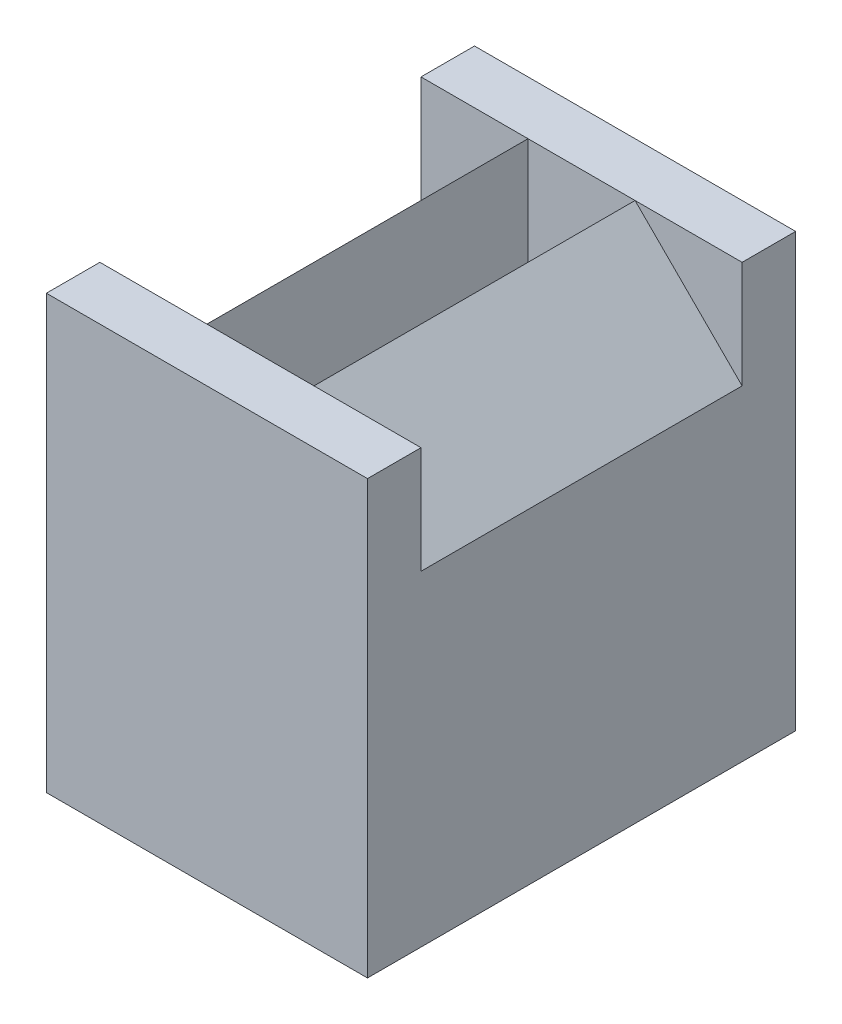
ISO-10303-21;
HEADER;
FILE_DESCRIPTION(('STEP AP214'),'2;1');
FILE_NAME('part.step','',(''),(''),'','','');
FILE_SCHEMA(('AUTOMOTIVE_DESIGN { 1 0 10303 214 1 1 1 1 }'));
ENDSEC;
DATA;
#1=APPLICATION_CONTEXT('core data for automotive mechanical design processes');
#2=APPLICATION_PROTOCOL_DEFINITION('international standard','automotive_design',2000,#1);
#3=PRODUCT_CONTEXT('',#1,'mechanical');
#4=PRODUCT('Part','Part','',(#3));
#5=PRODUCT_RELATED_PRODUCT_CATEGORY('part','',(#4));
#6=PRODUCT_DEFINITION_FORMATION('','',#4);
#7=PRODUCT_DEFINITION_CONTEXT('part definition',#1,'design');
#8=PRODUCT_DEFINITION('design','',#6,#7);
#9=PRODUCT_DEFINITION_SHAPE('','',#8);
#10=(LENGTH_UNIT() NAMED_UNIT(*) SI_UNIT(.MILLI.,.METRE.));
#11=(NAMED_UNIT(*) PLANE_ANGLE_UNIT() SI_UNIT($,.RADIAN.));
#12=(NAMED_UNIT(*) SI_UNIT($,.STERADIAN.) SOLID_ANGLE_UNIT());
#13=UNCERTAINTY_MEASURE_WITH_UNIT(LENGTH_MEASURE(1.E-05),#10,'distance_accuracy_value','');
#14=(GEOMETRIC_REPRESENTATION_CONTEXT(3) GLOBAL_UNCERTAINTY_ASSIGNED_CONTEXT((#13)) GLOBAL_UNIT_ASSIGNED_CONTEXT((#10,
#11,#12)) REPRESENTATION_CONTEXT('',''));
#15=CARTESIAN_POINT('',(0.,0.,0.));
#16=DIRECTION('',(0.,0.,1.));
#17=DIRECTION('',(1.,0.,0.));
#18=AXIS2_PLACEMENT_3D('',#15,#16,#17);
#19=CARTESIAN_POINT('',(10.,0.,40.));
#20=DIRECTION('',(-1.,0.,0.));
#21=DIRECTION('',(0.,0.,1.));
#22=AXIS2_PLACEMENT_3D('',#19,#20,#21);
#23=PLANE('',#22);
#24=DIRECTION('',(0.,1.,0.));
#25=VECTOR('',#24,1.);
#26=CARTESIAN_POINT('',(10.,0.,10.));
#27=LINE('',#26,#25);
#28=CARTESIAN_POINT('',(10.,20.4066823937675,10.));
#29=VERTEX_POINT('',#28);
#30=CARTESIAN_POINT('',(10.,40.4066823937675,10.));
#31=VERTEX_POINT('',#30);
#32=EDGE_CURVE('E268',#29,#31,#27,.T.);
#33=ORIENTED_EDGE('',*,*,#32,.F.);
#34=DIRECTION('',(0.,0.,-1.));
#35=VECTOR('',#34,1.);
#36=CARTESIAN_POINT('',(10.,20.4066823937675,40.));
#37=LINE('',#36,#35);
#38=CARTESIAN_POINT('',(10.,20.4066823937675,70.));
#39=VERTEX_POINT('',#38);
#40=EDGE_CURVE('E12',#39,#29,#37,.T.);
#41=ORIENTED_EDGE('',*,*,#40,.F.);
#42=DIRECTION('',(0.,1.,0.));
#43=VECTOR('',#42,1.);
#44=CARTESIAN_POINT('',(10.,0.,70.));
#45=LINE('',#44,#43);
#46=CARTESIAN_POINT('',(10.,40.4066823937675,70.));
#47=VERTEX_POINT('',#46);
#48=EDGE_CURVE('E182',#39,#47,#45,.T.);
#49=ORIENTED_EDGE('',*,*,#48,.T.);
#50=DIRECTION('',(0.,0.,-1.));
#51=VECTOR('',#50,1.);
#52=CARTESIAN_POINT('',(10.,40.4066823937675,40.));
#53=LINE('',#52,#51);
#54=EDGE_CURVE('E236',#47,#31,#53,.T.);
#55=ORIENTED_EDGE('',*,*,#54,.T.);
#56=EDGE_LOOP('',(#33,#41,#49,#55));
#57=FACE_BOUND('',#56,.T.);
#58=ADVANCED_FACE('F77',(#57),#23,.T.);
#59=CARTESIAN_POINT('',(0.,20.4066823937675,40.));
#60=DIRECTION('',(0.,1.,0.));
#61=DIRECTION('',(-1.,0.,0.));
#62=AXIS2_PLACEMENT_3D('',#59,#60,#61);
#63=PLANE('',#62);
#64=DIRECTION('',(1.,0.,0.));
#65=VECTOR('',#64,1.);
#66=CARTESIAN_POINT('',(0.,20.4066823937675,10.));
#67=LINE('',#66,#65);
#68=CARTESIAN_POINT('',(-9.99999999999999,20.4066823937675,10.));
#69=VERTEX_POINT('',#68);
#70=EDGE_CURVE('E265',#69,#29,#67,.T.);
#71=ORIENTED_EDGE('',*,*,#70,.F.);
#72=DIRECTION('',(0.,0.,-1.));
#73=VECTOR('',#72,1.);
#74=CARTESIAN_POINT('',(-9.99999999999999,20.4066823937675,40.));
#75=LINE('',#74,#73);
#76=CARTESIAN_POINT('',(-9.99999999999999,20.4066823937675,70.));
#77=VERTEX_POINT('',#76);
#78=EDGE_CURVE('E85',#77,#69,#75,.T.);
#79=ORIENTED_EDGE('',*,*,#78,.F.);
#80=DIRECTION('',(1.,0.,0.));
#81=VECTOR('',#80,1.);
#82=CARTESIAN_POINT('',(0.,20.4066823937675,70.));
#83=LINE('',#82,#81);
#84=EDGE_CURVE('E219',#77,#39,#83,.T.);
#85=ORIENTED_EDGE('',*,*,#84,.T.);
#86=ORIENTED_EDGE('',*,*,#40,.T.);
#87=EDGE_LOOP('',(#71,#79,#85,#86));
#88=FACE_BOUND('',#87,.T.);
#89=ADVANCED_FACE('F316',(#88),#63,.T.);
#90=CARTESIAN_POINT('',(-9.99999999999999,0.,40.));
#91=DIRECTION('',(-1.,0.,0.));
#92=DIRECTION('',(0.,0.,1.));
#93=AXIS2_PLACEMENT_3D('',#90,#91,#92);
#94=PLANE('',#93);
#95=ORIENTED_EDGE('',*,*,#78,.T.);
#96=DIRECTION('',(0.,1.,0.));
#97=VECTOR('',#96,1.);
#98=CARTESIAN_POINT('',(-9.99999999999999,0.,10.));
#99=LINE('',#98,#97);
#100=CARTESIAN_POINT('',(-9.99999999999999,40.4066823937675,10.));
#101=VERTEX_POINT('',#100);
#102=EDGE_CURVE('E299',#69,#101,#99,.T.);
#103=ORIENTED_EDGE('',*,*,#102,.T.);
#104=DIRECTION('',(0.,0.,-1.));
#105=VECTOR('',#104,1.);
#106=CARTESIAN_POINT('',(-9.99999999999999,40.4066823937675,40.));
#107=LINE('',#106,#105);
#108=CARTESIAN_POINT('',(-9.99999999999999,40.4066823937675,70.));
#109=VERTEX_POINT('',#108);
#110=EDGE_CURVE('E249',#109,#101,#107,.T.);
#111=ORIENTED_EDGE('',*,*,#110,.F.);
#112=DIRECTION('',(0.,1.,0.));
#113=VECTOR('',#112,1.);
#114=CARTESIAN_POINT('',(-9.99999999999999,0.,70.));
#115=LINE('',#114,#113);
#116=EDGE_CURVE('E322',#77,#109,#115,.T.);
#117=ORIENTED_EDGE('',*,*,#116,.F.);
#118=EDGE_LOOP('',(#95,#103,#111,#117));
#119=FACE_BOUND('',#118,.T.);
#120=ADVANCED_FACE('F320',(#119),#94,.F.);
#121=CARTESIAN_POINT('',(-25.2033411968839,25.2033411968832,40.));
#122=DIRECTION('',(0.707106781186556,-0.707106781186539,0.));
#123=DIRECTION('',(0.707106781186539,0.707106781186556,0.));
#124=AXIS2_PLACEMENT_3D('',#121,#122,#123);
#125=PLANE('',#124);
#126=ORIENTED_EDGE('',*,*,#110,.T.);
#127=DIRECTION('',(-0.707106781186539,-0.707106781186556,0.));
#128=VECTOR('',#127,1.);
#129=CARTESIAN_POINT('',(-25.2033411968839,25.2033411968832,10.));
#130=LINE('',#129,#128);
#131=CARTESIAN_POINT('',(-30.,20.4066823937669,9.99999999999999));
#132=VERTEX_POINT('',#131);
#133=EDGE_CURVE('E257',#101,#132,#130,.T.);
#134=ORIENTED_EDGE('',*,*,#133,.T.);
#135=DIRECTION('',(0.,0.,-1.));
#136=VECTOR('',#135,1.);
#137=CARTESIAN_POINT('',(-30.,20.4066823937669,40.));
#138=LINE('',#137,#136);
#139=CARTESIAN_POINT('',(-30.,20.4066823937669,70.));
#140=VERTEX_POINT('',#139);
#141=EDGE_CURVE('E229',#140,#132,#138,.T.);
#142=ORIENTED_EDGE('',*,*,#141,.F.);
#143=DIRECTION('',(-0.707106781186539,-0.707106781186556,0.));
#144=VECTOR('',#143,1.);
#145=CARTESIAN_POINT('',(-25.2033411968839,25.2033411968832,70.));
#146=LINE('',#145,#144);
#147=EDGE_CURVE('E181',#109,#140,#146,.T.);
#148=ORIENTED_EDGE('',*,*,#147,.F.);
#149=EDGE_LOOP('',(#126,#134,#142,#148));
#150=FACE_BOUND('',#149,.T.);
#151=ADVANCED_FACE('F351',(#150),#125,.F.);
#152=CARTESIAN_POINT('',(-30.,0.,40.));
#153=DIRECTION('',(-1.,0.,0.));
#154=DIRECTION('',(0.,0.,1.));
#155=AXIS2_PLACEMENT_3D('',#152,#153,#154);
#156=PLANE('',#155);
#157=DIRECTION('',(0.,1.,0.));
#158=VECTOR('',#157,1.);
#159=CARTESIAN_POINT('',(-30.,0.,0.));
#160=LINE('',#159,#158);
#161=CARTESIAN_POINT('',(-30.,-40.4066823937675,0.));
#162=VERTEX_POINT('',#161);
#163=CARTESIAN_POINT('',(-30.,40.4066823937675,0.));
#164=VERTEX_POINT('',#163);
#165=EDGE_CURVE('E228',#162,#164,#160,.T.);
#166=ORIENTED_EDGE('',*,*,#165,.F.);
#167=DIRECTION('',(0.,0.,-1.));
#168=VECTOR('',#167,1.);
#169=CARTESIAN_POINT('',(-30.,-40.4066823937675,40.));
#170=LINE('',#169,#168);
#171=CARTESIAN_POINT('',(-30.,-40.4066823937675,80.));
#172=VERTEX_POINT('',#171);
#173=EDGE_CURVE('E226',#172,#162,#170,.T.);
#174=ORIENTED_EDGE('',*,*,#173,.F.);
#175=DIRECTION('',(0.,1.,0.));
#176=VECTOR('',#175,1.);
#177=CARTESIAN_POINT('',(-30.,0.,80.));
#178=LINE('',#177,#176);
#179=CARTESIAN_POINT('',(-30.,40.4066823937675,80.));
#180=VERTEX_POINT('',#179);
#181=EDGE_CURVE('E203',#172,#180,#178,.T.);
#182=ORIENTED_EDGE('',*,*,#181,.T.);
#183=DIRECTION('',(0.,0.,1.));
#184=VECTOR('',#183,1.);
#185=CARTESIAN_POINT('',(-30.,40.4066823937675,70.));
#186=LINE('',#185,#184);
#187=CARTESIAN_POINT('',(-30.,40.4066823937675,70.));
#188=VERTEX_POINT('',#187);
#189=EDGE_CURVE('E176',#188,#180,#186,.T.);
#190=ORIENTED_EDGE('',*,*,#189,.F.);
#191=DIRECTION('',(0.,1.,0.));
#192=VECTOR('',#191,1.);
#193=CARTESIAN_POINT('',(-30.,0.,70.));
#194=LINE('',#193,#192);
#195=EDGE_CURVE('E207',#140,#188,#194,.T.);
#196=ORIENTED_EDGE('',*,*,#195,.F.);
#197=ORIENTED_EDGE('',*,*,#141,.T.);
#198=DIRECTION('',(0.,1.,0.));
#199=VECTOR('',#198,1.);
#200=CARTESIAN_POINT('',(-30.,0.,10.));
#201=LINE('',#200,#199);
#202=CARTESIAN_POINT('',(-30.,40.4066823937675,10.));
#203=VERTEX_POINT('',#202);
#204=EDGE_CURVE('E93',#132,#203,#201,.T.);
#205=ORIENTED_EDGE('',*,*,#204,.T.);
#206=DIRECTION('',(0.,0.,-1.));
#207=VECTOR('',#206,1.);
#208=CARTESIAN_POINT('',(-30.,40.4066823937675,10.));
#209=LINE('',#208,#207);
#210=EDGE_CURVE('E253',#203,#164,#209,.T.);
#211=ORIENTED_EDGE('',*,*,#210,.T.);
#212=EDGE_LOOP('',(#166,#174,#182,#190,#196,#197,#205,#211));
#213=FACE_BOUND('',#212,.T.);
#214=ADVANCED_FACE('F224',(#213),#156,.T.);
#215=CARTESIAN_POINT('',(0.,-40.4066823937675,40.));
#216=DIRECTION('',(0.,1.,0.));
#217=DIRECTION('',(0.,0.,1.));
#218=AXIS2_PLACEMENT_3D('',#215,#216,#217);
#219=PLANE('',#218);
#220=DIRECTION('',(1.,0.,0.));
#221=VECTOR('',#220,1.);
#222=CARTESIAN_POINT('',(0.,-40.4066823937675,0.));
#223=LINE('',#222,#221);
#224=CARTESIAN_POINT('',(30.,-40.4066823937675,0.));
#225=VERTEX_POINT('',#224);
#226=EDGE_CURVE('E101',#162,#225,#223,.T.);
#227=ORIENTED_EDGE('',*,*,#226,.T.);
#228=DIRECTION('',(0.,0.,-1.));
#229=VECTOR('',#228,1.);
#230=CARTESIAN_POINT('',(30.,-40.4066823937675,40.));
#231=LINE('',#230,#229);
#232=CARTESIAN_POINT('',(30.,-40.4066823937675,80.));
#233=VERTEX_POINT('',#232);
#234=EDGE_CURVE('E230',#233,#225,#231,.T.);
#235=ORIENTED_EDGE('',*,*,#234,.F.);
#236=DIRECTION('',(1.,0.,0.));
#237=VECTOR('',#236,1.);
#238=CARTESIAN_POINT('',(0.,-40.4066823937675,80.));
#239=LINE('',#238,#237);
#240=EDGE_CURVE('E197',#172,#233,#239,.T.);
#241=ORIENTED_EDGE('',*,*,#240,.F.);
#242=ORIENTED_EDGE('',*,*,#173,.T.);
#243=EDGE_LOOP('',(#227,#235,#241,#242));
#244=FACE_BOUND('',#243,.T.);
#245=ADVANCED_FACE('F232',(#244),#219,.F.);
#246=CARTESIAN_POINT('',(30.,0.,40.));
#247=DIRECTION('',(-1.,0.,0.));
#248=DIRECTION('',(0.,0.,1.));
#249=AXIS2_PLACEMENT_3D('',#246,#247,#248);
#250=PLANE('',#249);
#251=DIRECTION('',(0.,1.,0.));
#252=VECTOR('',#251,1.);
#253=CARTESIAN_POINT('',(30.,0.,0.));
#254=LINE('',#253,#252);
#255=CARTESIAN_POINT('',(30.,40.4066823937675,0.));
#256=VERTEX_POINT('',#255);
#257=EDGE_CURVE('E272',#225,#256,#254,.T.);
#258=ORIENTED_EDGE('',*,*,#257,.T.);
#259=DIRECTION('',(0.,0.,-1.));
#260=VECTOR('',#259,1.);
#261=CARTESIAN_POINT('',(30.,40.4066823937675,10.));
#262=LINE('',#261,#260);
#263=CARTESIAN_POINT('',(30.,40.4066823937675,10.));
#264=VERTEX_POINT('',#263);
#265=EDGE_CURVE('E201',#264,#256,#262,.T.);
#266=ORIENTED_EDGE('',*,*,#265,.F.);
#267=DIRECTION('',(0.,1.,0.));
#268=VECTOR('',#267,1.);
#269=CARTESIAN_POINT('',(30.,0.,10.));
#270=LINE('',#269,#268);
#271=CARTESIAN_POINT('',(30.,20.4066823937679,10.));
#272=VERTEX_POINT('',#271);
#273=EDGE_CURVE('E288',#272,#264,#270,.T.);
#274=ORIENTED_EDGE('',*,*,#273,.F.);
#275=DIRECTION('',(0.,0.,-1.));
#276=VECTOR('',#275,1.);
#277=CARTESIAN_POINT('',(30.,20.4066823937679,40.));
#278=LINE('',#277,#276);
#279=CARTESIAN_POINT('',(30.,20.4066823937679,70.));
#280=VERTEX_POINT('',#279);
#281=EDGE_CURVE('E234',#280,#272,#278,.T.);
#282=ORIENTED_EDGE('',*,*,#281,.F.);
#283=DIRECTION('',(0.,1.,0.));
#284=VECTOR('',#283,1.);
#285=CARTESIAN_POINT('',(30.,0.,70.));
#286=LINE('',#285,#284);
#287=CARTESIAN_POINT('',(30.,40.4066823937675,70.));
#288=VERTEX_POINT('',#287);
#289=EDGE_CURVE('E191',#280,#288,#286,.T.);
#290=ORIENTED_EDGE('',*,*,#289,.T.);
#291=DIRECTION('',(0.,0.,1.));
#292=VECTOR('',#291,1.);
#293=CARTESIAN_POINT('',(30.,40.4066823937675,70.));
#294=LINE('',#293,#292);
#295=CARTESIAN_POINT('',(30.,40.4066823937675,80.));
#296=VERTEX_POINT('',#295);
#297=EDGE_CURVE('E173',#288,#296,#294,.T.);
#298=ORIENTED_EDGE('',*,*,#297,.T.);
#299=DIRECTION('',(0.,1.,0.));
#300=VECTOR('',#299,1.);
#301=CARTESIAN_POINT('',(30.,0.,80.));
#302=LINE('',#301,#300);
#303=EDGE_CURVE('E188',#233,#296,#302,.T.);
#304=ORIENTED_EDGE('',*,*,#303,.F.);
#305=ORIENTED_EDGE('',*,*,#234,.T.);
#306=EDGE_LOOP('',(#258,#266,#274,#282,#290,#298,#304,#305));
#307=FACE_BOUND('',#306,.T.);
#308=ADVANCED_FACE('F187',(#307),#250,.F.);
#309=CARTESIAN_POINT('',(25.2033411968836,25.2033411968842,40.));
#310=DIRECTION('',(0.707106781186539,0.707106781186556,0.));
#311=DIRECTION('',(-0.707106781186556,0.707106781186539,0.));
#312=AXIS2_PLACEMENT_3D('',#309,#310,#311);
#313=PLANE('',#312);
#314=DIRECTION('',(0.707106781186556,-0.707106781186539,0.));
#315=VECTOR('',#314,1.);
#316=CARTESIAN_POINT('',(25.2033411968836,25.2033411968842,10.));
#317=LINE('',#316,#315);
#318=EDGE_CURVE('E286',#31,#272,#317,.T.);
#319=ORIENTED_EDGE('',*,*,#318,.F.);
#320=ORIENTED_EDGE('',*,*,#54,.F.);
#321=DIRECTION('',(0.707106781186556,-0.707106781186539,0.));
#322=VECTOR('',#321,1.);
#323=CARTESIAN_POINT('',(25.2033411968836,25.2033411968842,70.));
#324=LINE('',#323,#322);
#325=EDGE_CURVE('E192',#47,#280,#324,.T.);
#326=ORIENTED_EDGE('',*,*,#325,.T.);
#327=ORIENTED_EDGE('',*,*,#281,.T.);
#328=EDGE_LOOP('',(#319,#320,#326,#327));
#329=FACE_BOUND('',#328,.T.);
#330=ADVANCED_FACE('F346',(#329),#313,.T.);
#331=CARTESIAN_POINT('',(0.,0.,0.));
#332=DIRECTION('',(0.,0.,1.));
#333=DIRECTION('',(1.,0.,0.));
#334=AXIS2_PLACEMENT_3D('',#331,#332,#333);
#335=PLANE('',#334);
#336=DIRECTION('',(1.,0.,0.));
#337=VECTOR('',#336,1.);
#338=CARTESIAN_POINT('',(0.,40.4066823937675,0.));
#339=LINE('',#338,#337);
#340=EDGE_CURVE('E260',#164,#256,#339,.T.);
#341=ORIENTED_EDGE('',*,*,#340,.T.);
#342=ORIENTED_EDGE('',*,*,#257,.F.);
#343=ORIENTED_EDGE('',*,*,#226,.F.);
#344=ORIENTED_EDGE('',*,*,#165,.T.);
#345=EDGE_LOOP('',(#341,#342,#343,#344));
#346=FACE_BOUND('',#345,.T.);
#347=ADVANCED_FACE('F348',(#346),#335,.F.);
#348=CARTESIAN_POINT('',(0.,40.4066823937675,10.));
#349=DIRECTION('',(0.,1.,0.));
#350=DIRECTION('',(0.,0.,1.));
#351=AXIS2_PLACEMENT_3D('',#348,#349,#350);
#352=PLANE('',#351);
#353=ORIENTED_EDGE('',*,*,#340,.F.);
#354=ORIENTED_EDGE('',*,*,#210,.F.);
#355=DIRECTION('',(1.,0.,0.));
#356=VECTOR('',#355,1.);
#357=CARTESIAN_POINT('',(0.,40.4066823937675,10.));
#358=LINE('',#357,#356);
#359=EDGE_CURVE('E254',#203,#101,#358,.T.);
#360=ORIENTED_EDGE('',*,*,#359,.T.);
#361=DIRECTION('',(1.,0.,0.));
#362=VECTOR('',#361,1.);
#363=CARTESIAN_POINT('',(0.,40.4066823937675,10.));
#364=LINE('',#363,#362);
#365=EDGE_CURVE('E296',#101,#31,#364,.T.);
#366=ORIENTED_EDGE('',*,*,#365,.T.);
#367=DIRECTION('',(1.,0.,0.));
#368=VECTOR('',#367,1.);
#369=CARTESIAN_POINT('',(0.,40.4066823937675,10.));
#370=LINE('',#369,#368);
#371=EDGE_CURVE('E198',#31,#264,#370,.T.);
#372=ORIENTED_EDGE('',*,*,#371,.T.);
#373=ORIENTED_EDGE('',*,*,#265,.T.);
#374=EDGE_LOOP('',(#353,#354,#360,#366,#372,#373));
#375=FACE_BOUND('',#374,.T.);
#376=ADVANCED_FACE('F294',(#375),#352,.T.);
#377=CARTESIAN_POINT('',(0.,0.,10.));
#378=DIRECTION('',(0.,0.,1.));
#379=DIRECTION('',(1.,0.,0.));
#380=AXIS2_PLACEMENT_3D('',#377,#378,#379);
#381=PLANE('',#380);
#382=ORIENTED_EDGE('',*,*,#133,.F.);
#383=ORIENTED_EDGE('',*,*,#359,.F.);
#384=ORIENTED_EDGE('',*,*,#204,.F.);
#385=EDGE_LOOP('',(#382,#383,#384));
#386=FACE_BOUND('',#385,.T.);
#387=ADVANCED_FACE('F349',(#386),#381,.T.);
#388=CARTESIAN_POINT('',(0.,0.,10.));
#389=DIRECTION('',(0.,0.,1.));
#390=DIRECTION('',(1.,0.,0.));
#391=AXIS2_PLACEMENT_3D('',#388,#389,#390);
#392=PLANE('',#391);
#393=ORIENTED_EDGE('',*,*,#70,.T.);
#394=ORIENTED_EDGE('',*,*,#32,.T.);
#395=ORIENTED_EDGE('',*,*,#365,.F.);
#396=ORIENTED_EDGE('',*,*,#102,.F.);
#397=EDGE_LOOP('',(#393,#394,#395,#396));
#398=FACE_BOUND('',#397,.T.);
#399=ADVANCED_FACE('F313',(#398),#392,.T.);
#400=CARTESIAN_POINT('',(0.,0.,10.));
#401=DIRECTION('',(0.,0.,1.));
#402=DIRECTION('',(1.,0.,0.));
#403=AXIS2_PLACEMENT_3D('',#400,#401,#402);
#404=PLANE('',#403);
#405=ORIENTED_EDGE('',*,*,#371,.F.);
#406=ORIENTED_EDGE('',*,*,#318,.T.);
#407=ORIENTED_EDGE('',*,*,#273,.T.);
#408=EDGE_LOOP('',(#405,#406,#407));
#409=FACE_BOUND('',#408,.T.);
#410=ADVANCED_FACE('F285',(#409),#404,.T.);
#411=CARTESIAN_POINT('',(0.,0.,80.));
#412=DIRECTION('',(0.,0.,-1.));
#413=DIRECTION('',(1.,0.,0.));
#414=AXIS2_PLACEMENT_3D('',#411,#412,#413);
#415=PLANE('',#414);
#416=DIRECTION('',(1.,0.,0.));
#417=VECTOR('',#416,1.);
#418=CARTESIAN_POINT('',(0.,40.4066823937675,80.));
#419=LINE('',#418,#417);
#420=EDGE_CURVE('E169',#180,#296,#419,.T.);
#421=ORIENTED_EDGE('',*,*,#420,.F.);
#422=ORIENTED_EDGE('',*,*,#181,.F.);
#423=ORIENTED_EDGE('',*,*,#240,.T.);
#424=ORIENTED_EDGE('',*,*,#303,.T.);
#425=EDGE_LOOP('',(#421,#422,#423,#424));
#426=FACE_BOUND('',#425,.T.);
#427=ADVANCED_FACE('F195',(#426),#415,.F.);
#428=CARTESIAN_POINT('',(0.,40.4066823937675,70.));
#429=DIRECTION('',(0.,1.,0.));
#430=DIRECTION('',(0.,0.,-1.));
#431=AXIS2_PLACEMENT_3D('',#428,#429,#430);
#432=PLANE('',#431);
#433=ORIENTED_EDGE('',*,*,#420,.T.);
#434=ORIENTED_EDGE('',*,*,#297,.F.);
#435=DIRECTION('',(1.,0.,0.));
#436=VECTOR('',#435,1.);
#437=CARTESIAN_POINT('',(0.,40.4066823937675,70.));
#438=LINE('',#437,#436);
#439=EDGE_CURVE('E193',#47,#288,#438,.T.);
#440=ORIENTED_EDGE('',*,*,#439,.F.);
#441=DIRECTION('',(1.,0.,0.));
#442=VECTOR('',#441,1.);
#443=CARTESIAN_POINT('',(0.,40.4066823937675,70.));
#444=LINE('',#443,#442);
#445=EDGE_CURVE('E326',#109,#47,#444,.T.);
#446=ORIENTED_EDGE('',*,*,#445,.F.);
#447=DIRECTION('',(1.,0.,0.));
#448=VECTOR('',#447,1.);
#449=CARTESIAN_POINT('',(0.,40.4066823937675,70.));
#450=LINE('',#449,#448);
#451=EDGE_CURVE('E210',#188,#109,#450,.T.);
#452=ORIENTED_EDGE('',*,*,#451,.F.);
#453=ORIENTED_EDGE('',*,*,#189,.T.);
#454=EDGE_LOOP('',(#433,#434,#440,#446,#452,#453));
#455=FACE_BOUND('',#454,.T.);
#456=ADVANCED_FACE('F171',(#455),#432,.T.);
#457=CARTESIAN_POINT('',(0.,0.,70.));
#458=DIRECTION('',(0.,0.,-1.));
#459=DIRECTION('',(1.,0.,0.));
#460=AXIS2_PLACEMENT_3D('',#457,#458,#459);
#461=PLANE('',#460);
#462=ORIENTED_EDGE('',*,*,#147,.T.);
#463=ORIENTED_EDGE('',*,*,#195,.T.);
#464=ORIENTED_EDGE('',*,*,#451,.T.);
#465=EDGE_LOOP('',(#462,#463,#464));
#466=FACE_BOUND('',#465,.T.);
#467=ADVANCED_FACE('F353',(#466),#461,.T.);
#468=CARTESIAN_POINT('',(0.,0.,70.));
#469=DIRECTION('',(0.,0.,-1.));
#470=DIRECTION('',(1.,0.,0.));
#471=AXIS2_PLACEMENT_3D('',#468,#469,#470);
#472=PLANE('',#471);
#473=ORIENTED_EDGE('',*,*,#84,.F.);
#474=ORIENTED_EDGE('',*,*,#116,.T.);
#475=ORIENTED_EDGE('',*,*,#445,.T.);
#476=ORIENTED_EDGE('',*,*,#48,.F.);
#477=EDGE_LOOP('',(#473,#474,#475,#476));
#478=FACE_BOUND('',#477,.T.);
#479=ADVANCED_FACE('F328',(#478),#472,.T.);
#480=CARTESIAN_POINT('',(0.,0.,70.));
#481=DIRECTION('',(0.,0.,-1.));
#482=DIRECTION('',(1.,0.,0.));
#483=AXIS2_PLACEMENT_3D('',#480,#481,#482);
#484=PLANE('',#483);
#485=ORIENTED_EDGE('',*,*,#439,.T.);
#486=ORIENTED_EDGE('',*,*,#289,.F.);
#487=ORIENTED_EDGE('',*,*,#325,.F.);
#488=EDGE_LOOP('',(#485,#486,#487));
#489=FACE_BOUND('',#488,.T.);
#490=ADVANCED_FACE('F345',(#489),#484,.T.);
#491=CLOSED_SHELL('',(#58,#89,#120,#151,#214,#245,#308,#330,#347,#376,#387,#399,#410,#427,#456,
#467,#479,#490));
#492=MANIFOLD_SOLID_BREP('B2',#491);
#493=ADVANCED_BREP_SHAPE_REPRESENTATION('',(#18,#492),#14);
#494=SHAPE_DEFINITION_REPRESENTATION(#9,#493);
ENDSEC;
END-ISO-10303-21;
